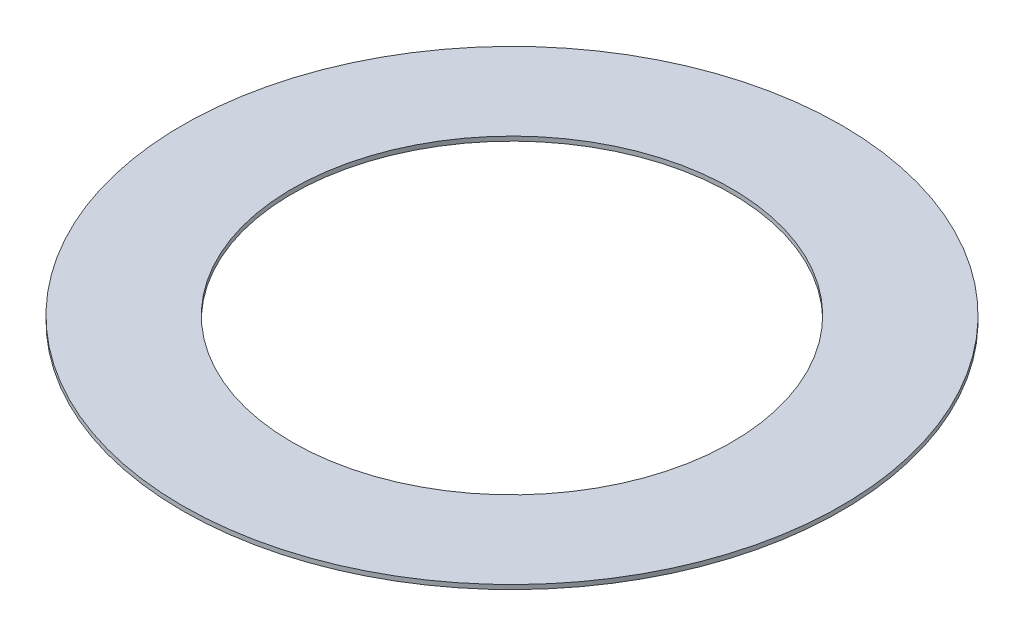
ISO-10303-21;
HEADER;
FILE_DESCRIPTION(('STEP AP214'),'2;1');
FILE_NAME('part.step','',(''),(''),'','','');
FILE_SCHEMA(('AUTOMOTIVE_DESIGN { 1 0 10303 214 1 1 1 1 }'));
ENDSEC;
DATA;
#1=APPLICATION_CONTEXT('core data for automotive mechanical design processes');
#2=APPLICATION_PROTOCOL_DEFINITION('international standard','automotive_design',2000,#1);
#3=PRODUCT_CONTEXT('',#1,'mechanical');
#4=PRODUCT('Part','Part','',(#3));
#5=PRODUCT_RELATED_PRODUCT_CATEGORY('part','',(#4));
#6=PRODUCT_DEFINITION_FORMATION('','',#4);
#7=PRODUCT_DEFINITION_CONTEXT('part definition',#1,'design');
#8=PRODUCT_DEFINITION('design','',#6,#7);
#9=PRODUCT_DEFINITION_SHAPE('','',#8);
#10=(LENGTH_UNIT() NAMED_UNIT(*) SI_UNIT(.MILLI.,.METRE.));
#11=(NAMED_UNIT(*) PLANE_ANGLE_UNIT() SI_UNIT($,.RADIAN.));
#12=(NAMED_UNIT(*) SI_UNIT($,.STERADIAN.) SOLID_ANGLE_UNIT());
#13=UNCERTAINTY_MEASURE_WITH_UNIT(LENGTH_MEASURE(1.E-05),#10,'distance_accuracy_value','');
#14=(GEOMETRIC_REPRESENTATION_CONTEXT(3) GLOBAL_UNCERTAINTY_ASSIGNED_CONTEXT((#13)) GLOBAL_UNIT_ASSIGNED_CONTEXT((#10,
#11,#12)) REPRESENTATION_CONTEXT('',''));
#15=CARTESIAN_POINT('',(0.,0.,0.));
#16=DIRECTION('',(0.,0.,1.));
#17=DIRECTION('',(1.,0.,0.));
#18=AXIS2_PLACEMENT_3D('',#15,#16,#17);
#19=CARTESIAN_POINT('',(0.,0.,0.));
#20=DIRECTION('',(0.,1.,0.));
#21=DIRECTION('',(0.,0.,1.));
#22=AXIS2_PLACEMENT_3D('',#19,#20,#21);
#23=PLANE('',#22);
#24=CARTESIAN_POINT('',(0.,0.,0.));
#25=DIRECTION('',(0.,1.,0.));
#26=DIRECTION('',(0.,0.,1.));
#27=AXIS2_PLACEMENT_3D('',#24,#25,#26);
#28=CIRCLE('',#27,0.5);
#29=CARTESIAN_POINT('',(0.,0.,0.5));
#30=VERTEX_POINT('',#29);
#31=EDGE_CURVE('E27',#30,#30,#28,.T.);
#32=ORIENTED_EDGE('',*,*,#31,.T.);
#33=EDGE_LOOP('',(#32));
#34=FACE_BOUND('',#33,.T.);
#35=CARTESIAN_POINT('',(0.,0.,0.));
#36=DIRECTION('',(0.,1.,0.));
#37=DIRECTION('',(0.,0.,1.));
#38=AXIS2_PLACEMENT_3D('',#35,#36,#37);
#39=CIRCLE('',#38,0.75);
#40=CARTESIAN_POINT('',(0.,0.,0.75));
#41=VERTEX_POINT('',#40);
#42=EDGE_CURVE('E18',#41,#41,#39,.T.);
#43=ORIENTED_EDGE('',*,*,#42,.F.);
#44=EDGE_LOOP('',(#43));
#45=FACE_BOUND('',#44,.T.);
#46=ADVANCED_FACE('F15',(#34,#45),#23,.F.);
#47=CARTESIAN_POINT('',(0.,0.,0.));
#48=DIRECTION('',(0.,1.,0.));
#49=DIRECTION('',(0.,0.,1.));
#50=AXIS2_PLACEMENT_3D('',#47,#48,#49);
#51=CYLINDRICAL_SURFACE('',#50,0.75);
#52=CARTESIAN_POINT('',(0.,0.01,0.));
#53=DIRECTION('',(0.,1.,0.));
#54=DIRECTION('',(0.,0.,1.));
#55=AXIS2_PLACEMENT_3D('',#52,#53,#54);
#56=CIRCLE('',#55,0.75);
#57=CARTESIAN_POINT('',(0.,0.01,0.75));
#58=VERTEX_POINT('',#57);
#59=EDGE_CURVE('E22',#58,#58,#56,.T.);
#60=ORIENTED_EDGE('',*,*,#59,.F.);
#61=EDGE_LOOP('',(#60));
#62=FACE_BOUND('',#61,.T.);
#63=ORIENTED_EDGE('',*,*,#42,.T.);
#64=EDGE_LOOP('',(#63));
#65=FACE_BOUND('',#64,.T.);
#66=ADVANCED_FACE('F35',(#62,#65),#51,.T.);
#67=CARTESIAN_POINT('',(0.,0.,0.));
#68=DIRECTION('',(0.,1.,0.));
#69=DIRECTION('',(0.,0.,1.));
#70=AXIS2_PLACEMENT_3D('',#67,#68,#69);
#71=CYLINDRICAL_SURFACE('',#70,0.5);
#72=ORIENTED_EDGE('',*,*,#31,.F.);
#73=EDGE_LOOP('',(#72));
#74=FACE_BOUND('',#73,.T.);
#75=CARTESIAN_POINT('',(0.,0.01,0.));
#76=DIRECTION('',(0.,1.,0.));
#77=DIRECTION('',(0.,0.,1.));
#78=AXIS2_PLACEMENT_3D('',#75,#76,#77);
#79=CIRCLE('',#78,0.5);
#80=CARTESIAN_POINT('',(0.,0.01,0.5));
#81=VERTEX_POINT('',#80);
#82=EDGE_CURVE('E10',#81,#81,#79,.F.);
#83=ORIENTED_EDGE('',*,*,#82,.F.);
#84=EDGE_LOOP('',(#83));
#85=FACE_BOUND('',#84,.T.);
#86=ADVANCED_FACE('F42',(#74,#85),#71,.F.);
#87=CARTESIAN_POINT('',(0.,0.01,0.));
#88=DIRECTION('',(0.,1.,0.));
#89=DIRECTION('',(0.,0.,1.));
#90=AXIS2_PLACEMENT_3D('',#87,#88,#89);
#91=PLANE('',#90);
#92=ORIENTED_EDGE('',*,*,#82,.T.);
#93=EDGE_LOOP('',(#92));
#94=FACE_BOUND('',#93,.T.);
#95=ORIENTED_EDGE('',*,*,#59,.T.);
#96=EDGE_LOOP('',(#95));
#97=FACE_BOUND('',#96,.T.);
#98=ADVANCED_FACE('F44',(#94,#97),#91,.T.);
#99=CLOSED_SHELL('',(#46,#66,#86,#98));
#100=MANIFOLD_SOLID_BREP('B1',#99);
#101=ADVANCED_BREP_SHAPE_REPRESENTATION('',(#18,#100),#14);
#102=SHAPE_DEFINITION_REPRESENTATION(#9,#101);
ENDSEC;
END-ISO-10303-21;
